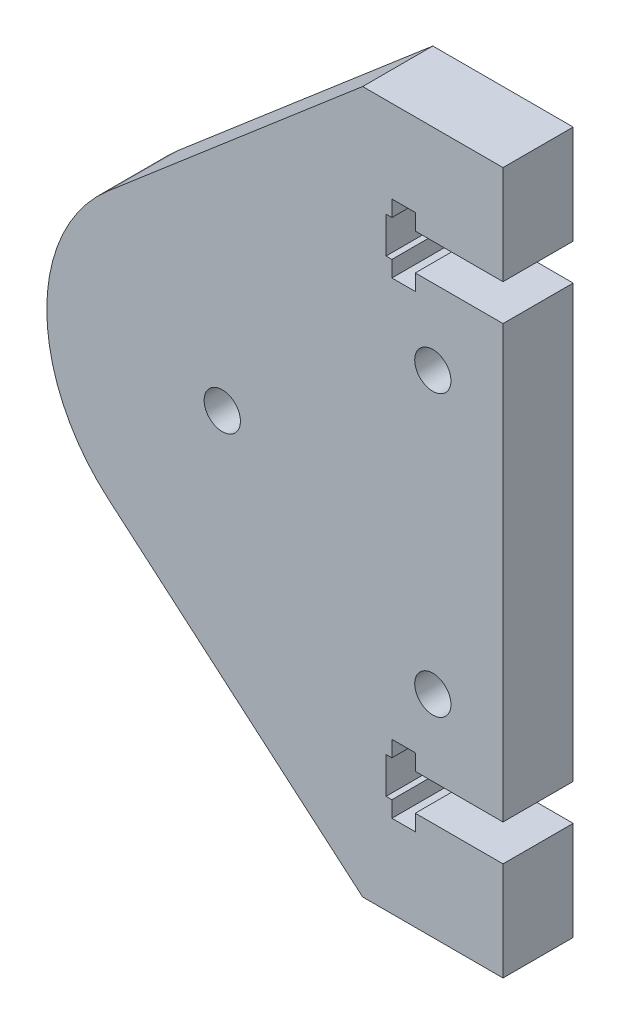
ISO-10303-21;
HEADER;
FILE_DESCRIPTION(('STEP AP214'),'2;1');
FILE_NAME('part.step','',(''),(''),'','','');
FILE_SCHEMA(('AUTOMOTIVE_DESIGN { 1 0 10303 214 1 1 1 1 }'));
ENDSEC;
DATA;
#1=APPLICATION_CONTEXT('core data for automotive mechanical design processes');
#2=APPLICATION_PROTOCOL_DEFINITION('international standard','automotive_design',2000,#1);
#3=PRODUCT_CONTEXT('',#1,'mechanical');
#4=PRODUCT('Part','Part','',(#3));
#5=PRODUCT_RELATED_PRODUCT_CATEGORY('part','',(#4));
#6=PRODUCT_DEFINITION_FORMATION('','',#4);
#7=PRODUCT_DEFINITION_CONTEXT('part definition',#1,'design');
#8=PRODUCT_DEFINITION('design','',#6,#7);
#9=PRODUCT_DEFINITION_SHAPE('','',#8);
#10=(LENGTH_UNIT() NAMED_UNIT(*) SI_UNIT(.MILLI.,.METRE.));
#11=(NAMED_UNIT(*) PLANE_ANGLE_UNIT() SI_UNIT($,.RADIAN.));
#12=(NAMED_UNIT(*) SI_UNIT($,.STERADIAN.) SOLID_ANGLE_UNIT());
#13=UNCERTAINTY_MEASURE_WITH_UNIT(LENGTH_MEASURE(1.E-05),#10,'distance_accuracy_value','');
#14=(GEOMETRIC_REPRESENTATION_CONTEXT(3) GLOBAL_UNCERTAINTY_ASSIGNED_CONTEXT((#13)) GLOBAL_UNIT_ASSIGNED_CONTEXT((#10,
#11,#12)) REPRESENTATION_CONTEXT('',''));
#15=CARTESIAN_POINT('',(0.,0.,0.));
#16=DIRECTION('',(0.,0.,1.));
#17=DIRECTION('',(1.,0.,0.));
#18=AXIS2_PLACEMENT_3D('',#15,#16,#17);
#19=CARTESIAN_POINT('',(-443.064585695293,-53.9557688613445,6.));
#20=DIRECTION('',(-1.,0.,0.));
#21=DIRECTION('',(0.,0.,1.));
#22=AXIS2_PLACEMENT_3D('',#19,#20,#21);
#23=PLANE('',#22);
#24=DIRECTION('',(0.,1.,0.));
#25=VECTOR('',#24,1.);
#26=CARTESIAN_POINT('',(-443.064585695293,-53.9557688613445,6.));
#27=LINE('',#26,#25);
#28=CARTESIAN_POINT('',(-443.064585695293,-62.4057688613445,6.));
#29=VERTEX_POINT('',#28);
#30=CARTESIAN_POINT('',(-443.064585695293,-53.9557688613445,6.));
#31=VERTEX_POINT('',#30);
#32=EDGE_CURVE('E259',#29,#31,#27,.T.);
#33=ORIENTED_EDGE('',*,*,#32,.F.);
#34=DIRECTION('',(0.,0.,-1.));
#35=VECTOR('',#34,1.);
#36=CARTESIAN_POINT('',(-443.064585695293,-62.4057688613445,6.));
#37=LINE('',#36,#35);
#38=CARTESIAN_POINT('',(-443.064585695293,-62.4057688613445,0.));
#39=VERTEX_POINT('',#38);
#40=EDGE_CURVE('E331',#29,#39,#37,.T.);
#41=ORIENTED_EDGE('',*,*,#40,.T.);
#42=DIRECTION('',(0.,1.,0.));
#43=VECTOR('',#42,1.);
#44=CARTESIAN_POINT('',(-443.064585695293,-53.9557688613445,0.));
#45=LINE('',#44,#43);
#46=CARTESIAN_POINT('',(-443.064585695293,-53.9557688613445,0.));
#47=VERTEX_POINT('',#46);
#48=EDGE_CURVE('E278',#39,#47,#45,.T.);
#49=ORIENTED_EDGE('',*,*,#48,.T.);
#50=DIRECTION('',(0.,0.,-1.));
#51=VECTOR('',#50,1.);
#52=CARTESIAN_POINT('',(-443.064585695293,-53.9557688613445,6.));
#53=LINE('',#52,#51);
#54=EDGE_CURVE('E42',#31,#47,#53,.T.);
#55=ORIENTED_EDGE('',*,*,#54,.F.);
#56=EDGE_LOOP('',(#33,#41,#49,#55));
#57=FACE_BOUND('',#56,.T.);
#58=ADVANCED_FACE('F34',(#57),#23,.F.);
#59=CARTESIAN_POINT('',(-443.064585695293,-102.405768861344,0.));
#60=VERTEX_POINT('',#59);
#61=CARTESIAN_POINT('',(-443.064585695293,-65.5057688613445,0.));
#62=VERTEX_POINT('',#61);
#63=EDGE_CURVE('E248',#60,#62,#45,.T.);
#64=ORIENTED_EDGE('',*,*,#63,.T.);
#65=DIRECTION('',(0.,0.,-1.));
#66=VECTOR('',#65,1.);
#67=CARTESIAN_POINT('',(-443.064585695293,-65.5057688613445,6.));
#68=LINE('',#67,#66);
#69=CARTESIAN_POINT('',(-443.064585695293,-65.5057688613445,6.));
#70=VERTEX_POINT('',#69);
#71=EDGE_CURVE('E49',#70,#62,#68,.T.);
#72=ORIENTED_EDGE('',*,*,#71,.F.);
#73=CARTESIAN_POINT('',(-443.064585695293,-102.405768861344,6.));
#74=VERTEX_POINT('',#73);
#75=EDGE_CURVE('E246',#74,#70,#27,.T.);
#76=ORIENTED_EDGE('',*,*,#75,.F.);
#77=DIRECTION('',(0.,0.,-1.));
#78=VECTOR('',#77,1.);
#79=CARTESIAN_POINT('',(-443.064585695293,-102.405768861344,6.));
#80=LINE('',#79,#78);
#81=EDGE_CURVE('E417',#74,#60,#80,.T.);
#82=ORIENTED_EDGE('',*,*,#81,.T.);
#83=EDGE_LOOP('',(#64,#72,#76,#82));
#84=FACE_BOUND('',#83,.T.);
#85=ADVANCED_FACE('F244',(#84),#23,.F.);
#86=CARTESIAN_POINT('',(-455.064585695293,-113.955768861344,6.));
#87=DIRECTION('',(0.,1.,0.));
#88=DIRECTION('',(0.,0.,1.));
#89=AXIS2_PLACEMENT_3D('',#86,#87,#88);
#90=PLANE('',#89);
#91=DIRECTION('',(1.,0.,0.));
#92=VECTOR('',#91,1.);
#93=CARTESIAN_POINT('',(-455.064585695293,-113.955768861344,0.));
#94=LINE('',#93,#92);
#95=CARTESIAN_POINT('',(-455.064585695293,-113.955768861344,0.));
#96=VERTEX_POINT('',#95);
#97=CARTESIAN_POINT('',(-443.064585695293,-113.955768861344,0.));
#98=VERTEX_POINT('',#97);
#99=EDGE_CURVE('E275',#96,#98,#94,.T.);
#100=ORIENTED_EDGE('',*,*,#99,.T.);
#101=DIRECTION('',(0.,0.,-1.));
#102=VECTOR('',#101,1.);
#103=CARTESIAN_POINT('',(-443.064585695293,-113.955768861344,6.));
#104=LINE('',#103,#102);
#105=CARTESIAN_POINT('',(-443.064585695293,-113.955768861344,6.));
#106=VERTEX_POINT('',#105);
#107=EDGE_CURVE('E11',#106,#98,#104,.T.);
#108=ORIENTED_EDGE('',*,*,#107,.F.);
#109=DIRECTION('',(1.,0.,0.));
#110=VECTOR('',#109,1.);
#111=CARTESIAN_POINT('',(-455.064585695293,-113.955768861344,6.));
#112=LINE('',#111,#110);
#113=CARTESIAN_POINT('',(-455.064585695293,-113.955768861344,6.));
#114=VERTEX_POINT('',#113);
#115=EDGE_CURVE('E263',#114,#106,#112,.T.);
#116=ORIENTED_EDGE('',*,*,#115,.F.);
#117=DIRECTION('',(0.,0.,-1.));
#118=VECTOR('',#117,1.);
#119=CARTESIAN_POINT('',(-455.064585695293,-113.955768861344,6.));
#120=LINE('',#119,#118);
#121=EDGE_CURVE('E274',#114,#96,#120,.T.);
#122=ORIENTED_EDGE('',*,*,#121,.T.);
#123=EDGE_LOOP('',(#100,#108,#116,#122));
#124=FACE_BOUND('',#123,.T.);
#125=ADVANCED_FACE('F36',(#124),#90,.F.);
#126=CARTESIAN_POINT('',(-443.064585695293,-105.505768861344,0.));
#127=VERTEX_POINT('',#126);
#128=EDGE_CURVE('E280',#98,#127,#45,.T.);
#129=ORIENTED_EDGE('',*,*,#128,.T.);
#130=DIRECTION('',(0.,0.,-1.));
#131=VECTOR('',#130,1.);
#132=CARTESIAN_POINT('',(-443.064585695293,-105.505768861344,6.));
#133=LINE('',#132,#131);
#134=CARTESIAN_POINT('',(-443.064585695293,-105.505768861344,6.));
#135=VERTEX_POINT('',#134);
#136=EDGE_CURVE('E57',#135,#127,#133,.T.);
#137=ORIENTED_EDGE('',*,*,#136,.F.);
#138=EDGE_CURVE('E258',#106,#135,#27,.T.);
#139=ORIENTED_EDGE('',*,*,#138,.F.);
#140=ORIENTED_EDGE('',*,*,#107,.T.);
#141=EDGE_LOOP('',(#129,#137,#139,#140));
#142=FACE_BOUND('',#141,.T.);
#143=ADVANCED_FACE('F462',(#142),#23,.F.);
#144=CARTESIAN_POINT('',(-443.064585695293,-53.9557688613445,6.));
#145=DIRECTION('',(0.,-1.,0.));
#146=DIRECTION('',(0.,0.,-1.));
#147=AXIS2_PLACEMENT_3D('',#144,#145,#146);
#148=PLANE('',#147);
#149=DIRECTION('',(-1.,0.,0.));
#150=VECTOR('',#149,1.);
#151=CARTESIAN_POINT('',(-443.064585695293,-53.9557688613445,0.));
#152=LINE('',#151,#150);
#153=CARTESIAN_POINT('',(-455.064585695293,-53.9557688613445,0.));
#154=VERTEX_POINT('',#153);
#155=EDGE_CURVE('E283',#47,#154,#152,.T.);
#156=ORIENTED_EDGE('',*,*,#155,.T.);
#157=DIRECTION('',(0.,0.,-1.));
#158=VECTOR('',#157,1.);
#159=CARTESIAN_POINT('',(-455.064585695293,-53.9557688613445,6.));
#160=LINE('',#159,#158);
#161=CARTESIAN_POINT('',(-455.064585695293,-53.9557688613445,6.));
#162=VERTEX_POINT('',#161);
#163=EDGE_CURVE('E299',#162,#154,#160,.T.);
#164=ORIENTED_EDGE('',*,*,#163,.F.);
#165=DIRECTION('',(-1.,0.,0.));
#166=VECTOR('',#165,1.);
#167=CARTESIAN_POINT('',(-443.064585695293,-53.9557688613445,6.));
#168=LINE('',#167,#166);
#169=EDGE_CURVE('E262',#31,#162,#168,.T.);
#170=ORIENTED_EDGE('',*,*,#169,.F.);
#171=ORIENTED_EDGE('',*,*,#54,.T.);
#172=EDGE_LOOP('',(#156,#164,#170,#171));
#173=FACE_BOUND('',#172,.T.);
#174=ADVANCED_FACE('F306',(#173),#148,.F.);
#175=CARTESIAN_POINT('',(-455.064585695293,-53.9557688613445,6.));
#176=DIRECTION('',(0.649947587428402,-0.759979034971359,0.));
#177=DIRECTION('',(0.75997903497136,0.649947587428403,0.));
#178=AXIS2_PLACEMENT_3D('',#175,#176,#177);
#179=PLANE('',#178);
#180=DIRECTION('',(-0.75997903497136,-0.649947587428403,0.));
#181=VECTOR('',#180,1.);
#182=CARTESIAN_POINT('',(-455.064585695293,-53.9557688613445,0.));
#183=LINE('',#182,#181);
#184=CARTESIAN_POINT('',(-476.813799506719,-72.5560833367741,0.));
#185=VERTEX_POINT('',#184);
#186=EDGE_CURVE('E285',#154,#185,#183,.T.);
#187=ORIENTED_EDGE('',*,*,#186,.T.);
#188=DIRECTION('',(0.,0.,-1.));
#189=VECTOR('',#188,1.);
#190=CARTESIAN_POINT('',(-476.813799506719,-72.5560833367741,6.));
#191=LINE('',#190,#189);
#192=CARTESIAN_POINT('',(-476.813799506719,-72.5560833367741,6.));
#193=VERTEX_POINT('',#192);
#194=EDGE_CURVE('E296',#193,#185,#191,.T.);
#195=ORIENTED_EDGE('',*,*,#194,.F.);
#196=DIRECTION('',(-0.75997903497136,-0.649947587428403,0.));
#197=VECTOR('',#196,1.);
#198=CARTESIAN_POINT('',(-455.064585695293,-53.9557688613445,6.));
#199=LINE('',#198,#197);
#200=EDGE_CURVE('E268',#162,#193,#199,.T.);
#201=ORIENTED_EDGE('',*,*,#200,.F.);
#202=ORIENTED_EDGE('',*,*,#163,.T.);
#203=EDGE_LOOP('',(#187,#195,#201,#202));
#204=FACE_BOUND('',#203,.T.);
#205=ADVANCED_FACE('F319',(#204),#179,.F.);
#206=CARTESIAN_POINT('',(-467.064585695293,-83.9557688613445,6.));
#207=DIRECTION('',(0.,0.,-1.));
#208=DIRECTION('',(-1.,0.,0.));
#209=AXIS2_PLACEMENT_3D('',#206,#207,#208);
#210=CYLINDRICAL_SURFACE('',#209,15.);
#211=CARTESIAN_POINT('',(-467.064585695293,-83.9557688613445,0.));
#212=DIRECTION('',(0.,0.,1.));
#213=DIRECTION('',(1.,0.,0.));
#214=AXIS2_PLACEMENT_3D('',#211,#212,#213);
#215=CIRCLE('',#214,15.);
#216=CARTESIAN_POINT('',(-476.813799506719,-95.3554543859149,0.));
#217=VERTEX_POINT('',#216);
#218=EDGE_CURVE('E287',#185,#217,#215,.T.);
#219=ORIENTED_EDGE('',*,*,#218,.T.);
#220=DIRECTION('',(0.,0.,-1.));
#221=VECTOR('',#220,1.);
#222=CARTESIAN_POINT('',(-476.813799506719,-95.3554543859149,6.));
#223=LINE('',#222,#221);
#224=CARTESIAN_POINT('',(-476.813799506719,-95.3554543859149,6.));
#225=VERTEX_POINT('',#224);
#226=EDGE_CURVE('E293',#225,#217,#223,.T.);
#227=ORIENTED_EDGE('',*,*,#226,.F.);
#228=CARTESIAN_POINT('',(-467.064585695293,-83.9557688613445,6.));
#229=DIRECTION('',(0.,0.,1.));
#230=DIRECTION('',(1.,0.,0.));
#231=AXIS2_PLACEMENT_3D('',#228,#229,#230);
#232=CIRCLE('',#231,15.);
#233=EDGE_CURVE('E270',#193,#225,#232,.T.);
#234=ORIENTED_EDGE('',*,*,#233,.F.);
#235=ORIENTED_EDGE('',*,*,#194,.T.);
#236=EDGE_LOOP('',(#219,#227,#234,#235));
#237=FACE_BOUND('',#236,.T.);
#238=ADVANCED_FACE('F323',(#237),#210,.T.);
#239=CARTESIAN_POINT('',(-455.064585695293,-113.955768861344,6.));
#240=DIRECTION('',(0.649947587428402,0.75997903497136,0.));
#241=DIRECTION('',(-0.75997903497136,0.649947587428402,0.));
#242=AXIS2_PLACEMENT_3D('',#239,#240,#241);
#243=PLANE('',#242);
#244=DIRECTION('',(0.75997903497136,-0.649947587428402,0.));
#245=VECTOR('',#244,1.);
#246=CARTESIAN_POINT('',(-455.064585695293,-113.955768861344,0.));
#247=LINE('',#246,#245);
#248=EDGE_CURVE('E289',#217,#96,#247,.T.);
#249=ORIENTED_EDGE('',*,*,#248,.T.);
#250=ORIENTED_EDGE('',*,*,#121,.F.);
#251=DIRECTION('',(0.75997903497136,-0.649947587428402,0.));
#252=VECTOR('',#251,1.);
#253=CARTESIAN_POINT('',(-455.064585695293,-113.955768861344,6.));
#254=LINE('',#253,#252);
#255=EDGE_CURVE('E272',#225,#114,#254,.T.);
#256=ORIENTED_EDGE('',*,*,#255,.F.);
#257=ORIENTED_EDGE('',*,*,#226,.T.);
#258=EDGE_LOOP('',(#249,#250,#256,#257));
#259=FACE_BOUND('',#258,.T.);
#260=ADVANCED_FACE('F447',(#259),#243,.F.);
#261=CARTESIAN_POINT('',(-467.064585695293,-83.9557688613445,6.));
#262=DIRECTION('',(0.,0.,1.));
#263=DIRECTION('',(1.,0.,0.));
#264=AXIS2_PLACEMENT_3D('',#261,#262,#263);
#265=PLANE('',#264);
#266=CARTESIAN_POINT('',(-449.064585016784,-71.9707693447421,6.));
#267=DIRECTION('',(0.,0.,-1.));
#268=DIRECTION('',(-1.,0.,0.));
#269=AXIS2_PLACEMENT_3D('',#266,#267,#268);
#270=CIRCLE('',#269,1.55000000000005);
#271=CARTESIAN_POINT('',(-450.614585016784,-71.9707693447421,6.));
#272=VERTEX_POINT('',#271);
#273=EDGE_CURVE('E811',#272,#272,#270,.T.);
#274=ORIENTED_EDGE('',*,*,#273,.T.);
#275=EDGE_LOOP('',(#274));
#276=FACE_BOUND('',#275,.T.);
#277=CARTESIAN_POINT('',(-449.064585016784,-95.9367759641504,6.));
#278=DIRECTION('',(0.,0.,-1.));
#279=DIRECTION('',(-1.,0.,0.));
#280=AXIS2_PLACEMENT_3D('',#277,#278,#279);
#281=CIRCLE('',#280,1.55000000000005);
#282=CARTESIAN_POINT('',(-450.614585016784,-95.9367759641504,6.));
#283=VERTEX_POINT('',#282);
#284=EDGE_CURVE('E522',#283,#283,#281,.T.);
#285=ORIENTED_EDGE('',*,*,#284,.T.);
#286=EDGE_LOOP('',(#285));
#287=FACE_BOUND('',#286,.T.);
#288=DIRECTION('',(1.,0.,0.));
#289=VECTOR('',#288,1.);
#290=CARTESIAN_POINT('',(-443.064585695293,-62.4057688613445,6.));
#291=LINE('',#290,#289);
#292=CARTESIAN_POINT('',(-450.564585695293,-62.4057688613445,6.));
#293=VERTEX_POINT('',#292);
#294=EDGE_CURVE('E249',#293,#29,#291,.T.);
#295=ORIENTED_EDGE('',*,*,#294,.T.);
#296=ORIENTED_EDGE('',*,*,#32,.T.);
#297=ORIENTED_EDGE('',*,*,#169,.T.);
#298=ORIENTED_EDGE('',*,*,#200,.T.);
#299=ORIENTED_EDGE('',*,*,#233,.T.);
#300=ORIENTED_EDGE('',*,*,#255,.T.);
#301=ORIENTED_EDGE('',*,*,#115,.T.);
#302=ORIENTED_EDGE('',*,*,#138,.T.);
#303=DIRECTION('',(-1.,0.,0.));
#304=VECTOR('',#303,1.);
#305=CARTESIAN_POINT('',(-443.064585695293,-105.505768861344,6.));
#306=LINE('',#305,#304);
#307=CARTESIAN_POINT('',(-450.564585695293,-105.505768861344,6.));
#308=VERTEX_POINT('',#307);
#309=EDGE_CURVE('E359',#135,#308,#306,.T.);
#310=ORIENTED_EDGE('',*,*,#309,.T.);
#311=DIRECTION('',(0.,-1.,0.));
#312=VECTOR('',#311,1.);
#313=CARTESIAN_POINT('',(-450.564585695293,-106.880768861344,6.));
#314=LINE('',#313,#312);
#315=CARTESIAN_POINT('',(-450.564585695293,-106.880768861344,6.));
#316=VERTEX_POINT('',#315);
#317=EDGE_CURVE('E362',#308,#316,#314,.T.);
#318=ORIENTED_EDGE('',*,*,#317,.T.);
#319=DIRECTION('',(-1.,0.,0.));
#320=VECTOR('',#319,1.);
#321=CARTESIAN_POINT('',(-452.564585695293,-106.880768861344,6.));
#322=LINE('',#321,#320);
#323=CARTESIAN_POINT('',(-452.564585695293,-106.880768861344,6.));
#324=VERTEX_POINT('',#323);
#325=EDGE_CURVE('E366',#316,#324,#322,.T.);
#326=ORIENTED_EDGE('',*,*,#325,.T.);
#327=DIRECTION('',(0.,1.,0.));
#328=VECTOR('',#327,1.);
#329=CARTESIAN_POINT('',(-452.564585695293,-106.880768861344,6.));
#330=LINE('',#329,#328);
#331=CARTESIAN_POINT('',(-452.564585695293,-105.505768861344,6.));
#332=VERTEX_POINT('',#331);
#333=EDGE_CURVE('E369',#324,#332,#330,.T.);
#334=ORIENTED_EDGE('',*,*,#333,.T.);
#335=DIRECTION('',(-1.,0.,0.));
#336=VECTOR('',#335,1.);
#337=CARTESIAN_POINT('',(-452.564585695293,-105.505768861344,6.));
#338=LINE('',#337,#336);
#339=CARTESIAN_POINT('',(-453.064585695293,-105.505768861344,6.));
#340=VERTEX_POINT('',#339);
#341=EDGE_CURVE('E372',#332,#340,#338,.T.);
#342=ORIENTED_EDGE('',*,*,#341,.T.);
#343=DIRECTION('',(0.,1.,0.));
#344=VECTOR('',#343,1.);
#345=CARTESIAN_POINT('',(-453.064585695293,-105.505768861344,6.));
#346=LINE('',#345,#344);
#347=CARTESIAN_POINT('',(-453.064585695293,-102.405768861344,6.));
#348=VERTEX_POINT('',#347);
#349=EDGE_CURVE('E375',#340,#348,#346,.T.);
#350=ORIENTED_EDGE('',*,*,#349,.T.);
#351=DIRECTION('',(1.,0.,0.));
#352=VECTOR('',#351,1.);
#353=CARTESIAN_POINT('',(-452.564585695293,-102.405768861344,6.));
#354=LINE('',#353,#352);
#355=CARTESIAN_POINT('',(-452.564585695293,-102.405768861344,6.));
#356=VERTEX_POINT('',#355);
#357=EDGE_CURVE('E378',#348,#356,#354,.T.);
#358=ORIENTED_EDGE('',*,*,#357,.T.);
#359=DIRECTION('',(0.,1.,0.));
#360=VECTOR('',#359,1.);
#361=CARTESIAN_POINT('',(-452.564585695293,-102.405768861344,6.));
#362=LINE('',#361,#360);
#363=CARTESIAN_POINT('',(-452.564585695293,-101.030768861344,6.));
#364=VERTEX_POINT('',#363);
#365=EDGE_CURVE('E381',#356,#364,#362,.T.);
#366=ORIENTED_EDGE('',*,*,#365,.T.);
#367=DIRECTION('',(1.,0.,0.));
#368=VECTOR('',#367,1.);
#369=CARTESIAN_POINT('',(-452.564585695293,-101.030768861344,6.));
#370=LINE('',#369,#368);
#371=CARTESIAN_POINT('',(-450.564585695293,-101.030768861344,6.));
#372=VERTEX_POINT('',#371);
#373=EDGE_CURVE('E384',#364,#372,#370,.T.);
#374=ORIENTED_EDGE('',*,*,#373,.T.);
#375=DIRECTION('',(0.,-1.,0.));
#376=VECTOR('',#375,1.);
#377=CARTESIAN_POINT('',(-450.564585695293,-102.405768861344,6.));
#378=LINE('',#377,#376);
#379=CARTESIAN_POINT('',(-450.564585695293,-102.405768861344,6.));
#380=VERTEX_POINT('',#379);
#381=EDGE_CURVE('E387',#372,#380,#378,.T.);
#382=ORIENTED_EDGE('',*,*,#381,.T.);
#383=DIRECTION('',(1.,0.,0.));
#384=VECTOR('',#383,1.);
#385=CARTESIAN_POINT('',(-443.064585695293,-102.405768861344,6.));
#386=LINE('',#385,#384);
#387=EDGE_CURVE('E257',#380,#74,#386,.T.);
#388=ORIENTED_EDGE('',*,*,#387,.T.);
#389=ORIENTED_EDGE('',*,*,#75,.T.);
#390=DIRECTION('',(-1.,0.,0.));
#391=VECTOR('',#390,1.);
#392=CARTESIAN_POINT('',(-443.064585695293,-65.5057688613445,6.));
#393=LINE('',#392,#391);
#394=CARTESIAN_POINT('',(-450.564585695293,-65.5057688613445,6.));
#395=VERTEX_POINT('',#394);
#396=EDGE_CURVE('E231',#70,#395,#393,.T.);
#397=ORIENTED_EDGE('',*,*,#396,.T.);
#398=DIRECTION('',(0.,-1.,0.));
#399=VECTOR('',#398,1.);
#400=CARTESIAN_POINT('',(-450.564585695293,-66.8807688613445,6.));
#401=LINE('',#400,#399);
#402=CARTESIAN_POINT('',(-450.564585695293,-66.8807688613445,6.));
#403=VERTEX_POINT('',#402);
#404=EDGE_CURVE('E238',#395,#403,#401,.T.);
#405=ORIENTED_EDGE('',*,*,#404,.T.);
#406=DIRECTION('',(-1.,0.,0.));
#407=VECTOR('',#406,1.);
#408=CARTESIAN_POINT('',(-452.564585695293,-66.8807688613445,6.));
#409=LINE('',#408,#407);
#410=CARTESIAN_POINT('',(-452.564585695293,-66.8807688613445,6.));
#411=VERTEX_POINT('',#410);
#412=EDGE_CURVE('E595',#403,#411,#409,.T.);
#413=ORIENTED_EDGE('',*,*,#412,.T.);
#414=DIRECTION('',(0.,1.,0.));
#415=VECTOR('',#414,1.);
#416=CARTESIAN_POINT('',(-452.564585695293,-66.8807688613445,6.));
#417=LINE('',#416,#415);
#418=CARTESIAN_POINT('',(-452.564585695293,-65.5057688613445,6.));
#419=VERTEX_POINT('',#418);
#420=EDGE_CURVE('E599',#411,#419,#417,.T.);
#421=ORIENTED_EDGE('',*,*,#420,.T.);
#422=DIRECTION('',(-1.,0.,0.));
#423=VECTOR('',#422,1.);
#424=CARTESIAN_POINT('',(-452.564585695293,-65.5057688613445,6.));
#425=LINE('',#424,#423);
#426=CARTESIAN_POINT('',(-453.064585695293,-65.5057688613445,6.));
#427=VERTEX_POINT('',#426);
#428=EDGE_CURVE('E586',#419,#427,#425,.T.);
#429=ORIENTED_EDGE('',*,*,#428,.T.);
#430=DIRECTION('',(0.,1.,0.));
#431=VECTOR('',#430,1.);
#432=CARTESIAN_POINT('',(-453.064585695293,-65.5057688613445,6.));
#433=LINE('',#432,#431);
#434=CARTESIAN_POINT('',(-453.064585695293,-62.4057688613445,6.));
#435=VERTEX_POINT('',#434);
#436=EDGE_CURVE('E581',#427,#435,#433,.T.);
#437=ORIENTED_EDGE('',*,*,#436,.T.);
#438=DIRECTION('',(1.,0.,0.));
#439=VECTOR('',#438,1.);
#440=CARTESIAN_POINT('',(-452.564585695293,-62.4057688613445,6.));
#441=LINE('',#440,#439);
#442=CARTESIAN_POINT('',(-452.564585695293,-62.4057688613445,6.));
#443=VERTEX_POINT('',#442);
#444=EDGE_CURVE('E606',#435,#443,#441,.T.);
#445=ORIENTED_EDGE('',*,*,#444,.T.);
#446=DIRECTION('',(0.,1.,0.));
#447=VECTOR('',#446,1.);
#448=CARTESIAN_POINT('',(-452.564585695293,-62.4057688613445,6.));
#449=LINE('',#448,#447);
#450=CARTESIAN_POINT('',(-452.564585695293,-61.0307688613445,6.));
#451=VERTEX_POINT('',#450);
#452=EDGE_CURVE('E569',#443,#451,#449,.T.);
#453=ORIENTED_EDGE('',*,*,#452,.T.);
#454=DIRECTION('',(1.,0.,0.));
#455=VECTOR('',#454,1.);
#456=CARTESIAN_POINT('',(-452.564585695293,-61.0307688613445,6.));
#457=LINE('',#456,#455);
#458=CARTESIAN_POINT('',(-450.564585695293,-61.0307688613445,6.));
#459=VERTEX_POINT('',#458);
#460=EDGE_CURVE('E564',#451,#459,#457,.T.);
#461=ORIENTED_EDGE('',*,*,#460,.T.);
#462=DIRECTION('',(0.,-1.,0.));
#463=VECTOR('',#462,1.);
#464=CARTESIAN_POINT('',(-450.564585695293,-62.4057688613445,6.));
#465=LINE('',#464,#463);
#466=EDGE_CURVE('E609',#459,#293,#465,.T.);
#467=ORIENTED_EDGE('',*,*,#466,.T.);
#468=EDGE_LOOP('',(#295,#296,#297,#298,#299,#300,#301,#302,#310,#318,#326,#334,#342,#350,#358,
#366,#374,#382,#388,#389,#397,#405,#413,#421,#429,#437,#445,#453,#461,#467));
#469=FACE_BOUND('',#468,.T.);
#470=CARTESIAN_POINT('',(-467.064585695293,-83.9557688613445,6.));
#471=DIRECTION('',(0.,0.,1.));
#472=DIRECTION('',(1.,0.,0.));
#473=AXIS2_PLACEMENT_3D('',#470,#471,#472);
#474=CIRCLE('',#473,1.54999999999999);
#475=CARTESIAN_POINT('',(-465.514585695293,-83.9557688613445,6.));
#476=VERTEX_POINT('',#475);
#477=EDGE_CURVE('E419',#476,#476,#474,.T.);
#478=ORIENTED_EDGE('',*,*,#477,.F.);
#479=EDGE_LOOP('',(#478));
#480=FACE_BOUND('',#479,.T.);
#481=ADVANCED_FACE('F253',(#276,#287,#469,#480),#265,.T.);
#482=CARTESIAN_POINT('',(-467.064585695293,-83.9557688613445,0.));
#483=DIRECTION('',(0.,0.,1.));
#484=DIRECTION('',(1.,0.,0.));
#485=AXIS2_PLACEMENT_3D('',#482,#483,#484);
#486=PLANE('',#485);
#487=CARTESIAN_POINT('',(-449.064585016784,-71.9707693447421,0.));
#488=DIRECTION('',(0.,0.,-1.));
#489=DIRECTION('',(-1.,0.,0.));
#490=AXIS2_PLACEMENT_3D('',#487,#488,#489);
#491=CIRCLE('',#490,1.55000000000005);
#492=CARTESIAN_POINT('',(-450.614585016784,-71.9707693447421,0.));
#493=VERTEX_POINT('',#492);
#494=EDGE_CURVE('E814',#493,#493,#491,.T.);
#495=ORIENTED_EDGE('',*,*,#494,.F.);
#496=EDGE_LOOP('',(#495));
#497=FACE_BOUND('',#496,.T.);
#498=CARTESIAN_POINT('',(-449.064585016784,-95.9367759641504,0.));
#499=DIRECTION('',(0.,0.,-1.));
#500=DIRECTION('',(-1.,0.,0.));
#501=AXIS2_PLACEMENT_3D('',#498,#499,#500);
#502=CIRCLE('',#501,1.55000000000005);
#503=CARTESIAN_POINT('',(-450.614585016784,-95.9367759641504,0.));
#504=VERTEX_POINT('',#503);
#505=EDGE_CURVE('E527',#504,#504,#502,.T.);
#506=ORIENTED_EDGE('',*,*,#505,.F.);
#507=EDGE_LOOP('',(#506));
#508=FACE_BOUND('',#507,.T.);
#509=CARTESIAN_POINT('',(-467.064585695293,-83.9557688613445,0.));
#510=DIRECTION('',(0.,0.,1.));
#511=DIRECTION('',(1.,0.,0.));
#512=AXIS2_PLACEMENT_3D('',#509,#510,#511);
#513=CIRCLE('',#512,1.54999999999999);
#514=CARTESIAN_POINT('',(-465.514585695293,-83.9557688613445,0.));
#515=VERTEX_POINT('',#514);
#516=EDGE_CURVE('E279',#515,#515,#513,.T.);
#517=ORIENTED_EDGE('',*,*,#516,.T.);
#518=EDGE_LOOP('',(#517));
#519=FACE_BOUND('',#518,.T.);
#520=ORIENTED_EDGE('',*,*,#48,.F.);
#521=DIRECTION('',(1.,0.,0.));
#522=VECTOR('',#521,1.);
#523=CARTESIAN_POINT('',(-443.064585695293,-62.4057688613445,0.));
#524=LINE('',#523,#522);
#525=CARTESIAN_POINT('',(-450.564585695293,-62.4057688613445,0.));
#526=VERTEX_POINT('',#525);
#527=EDGE_CURVE('E239',#526,#39,#524,.T.);
#528=ORIENTED_EDGE('',*,*,#527,.F.);
#529=DIRECTION('',(0.,-1.,0.));
#530=VECTOR('',#529,1.);
#531=CARTESIAN_POINT('',(-450.564585695293,-62.4057688613445,0.));
#532=LINE('',#531,#530);
#533=CARTESIAN_POINT('',(-450.564585695293,-61.0307688613445,0.));
#534=VERTEX_POINT('',#533);
#535=EDGE_CURVE('E551',#534,#526,#532,.T.);
#536=ORIENTED_EDGE('',*,*,#535,.F.);
#537=DIRECTION('',(1.,0.,0.));
#538=VECTOR('',#537,1.);
#539=CARTESIAN_POINT('',(-452.564585695293,-61.0307688613445,0.));
#540=LINE('',#539,#538);
#541=CARTESIAN_POINT('',(-452.564585695293,-61.0307688613445,0.));
#542=VERTEX_POINT('',#541);
#543=EDGE_CURVE('E549',#542,#534,#540,.T.);
#544=ORIENTED_EDGE('',*,*,#543,.F.);
#545=DIRECTION('',(0.,1.,0.));
#546=VECTOR('',#545,1.);
#547=CARTESIAN_POINT('',(-452.564585695293,-62.4057688613445,0.));
#548=LINE('',#547,#546);
#549=CARTESIAN_POINT('',(-452.564585695293,-62.4057688613445,0.));
#550=VERTEX_POINT('',#549);
#551=EDGE_CURVE('E546',#550,#542,#548,.T.);
#552=ORIENTED_EDGE('',*,*,#551,.F.);
#553=DIRECTION('',(1.,0.,0.));
#554=VECTOR('',#553,1.);
#555=CARTESIAN_POINT('',(-452.564585695293,-62.4057688613445,0.));
#556=LINE('',#555,#554);
#557=CARTESIAN_POINT('',(-453.064585695293,-62.4057688613445,0.));
#558=VERTEX_POINT('',#557);
#559=EDGE_CURVE('E543',#558,#550,#556,.T.);
#560=ORIENTED_EDGE('',*,*,#559,.F.);
#561=DIRECTION('',(0.,1.,0.));
#562=VECTOR('',#561,1.);
#563=CARTESIAN_POINT('',(-453.064585695293,-65.5057688613445,0.));
#564=LINE('',#563,#562);
#565=CARTESIAN_POINT('',(-453.064585695293,-65.5057688613445,0.));
#566=VERTEX_POINT('',#565);
#567=EDGE_CURVE('E540',#566,#558,#564,.T.);
#568=ORIENTED_EDGE('',*,*,#567,.F.);
#569=DIRECTION('',(-1.,0.,0.));
#570=VECTOR('',#569,1.);
#571=CARTESIAN_POINT('',(-452.564585695293,-65.5057688613445,0.));
#572=LINE('',#571,#570);
#573=CARTESIAN_POINT('',(-452.564585695293,-65.5057688613445,0.));
#574=VERTEX_POINT('',#573);
#575=EDGE_CURVE('E537',#574,#566,#572,.T.);
#576=ORIENTED_EDGE('',*,*,#575,.F.);
#577=DIRECTION('',(0.,1.,0.));
#578=VECTOR('',#577,1.);
#579=CARTESIAN_POINT('',(-452.564585695293,-66.8807688613445,0.));
#580=LINE('',#579,#578);
#581=CARTESIAN_POINT('',(-452.564585695293,-66.8807688613445,0.));
#582=VERTEX_POINT('',#581);
#583=EDGE_CURVE('E534',#582,#574,#580,.T.);
#584=ORIENTED_EDGE('',*,*,#583,.F.);
#585=DIRECTION('',(-1.,0.,0.));
#586=VECTOR('',#585,1.);
#587=CARTESIAN_POINT('',(-452.564585695293,-66.8807688613445,0.));
#588=LINE('',#587,#586);
#589=CARTESIAN_POINT('',(-450.564585695293,-66.8807688613445,0.));
#590=VERTEX_POINT('',#589);
#591=EDGE_CURVE('E524',#590,#582,#588,.T.);
#592=ORIENTED_EDGE('',*,*,#591,.F.);
#593=DIRECTION('',(0.,-1.,0.));
#594=VECTOR('',#593,1.);
#595=CARTESIAN_POINT('',(-450.564585695293,-66.8807688613445,0.));
#596=LINE('',#595,#594);
#597=CARTESIAN_POINT('',(-450.564585695293,-65.5057688613445,0.));
#598=VERTEX_POINT('',#597);
#599=EDGE_CURVE('E521',#598,#590,#596,.T.);
#600=ORIENTED_EDGE('',*,*,#599,.F.);
#601=DIRECTION('',(-1.,0.,0.));
#602=VECTOR('',#601,1.);
#603=CARTESIAN_POINT('',(-443.064585695293,-65.5057688613445,0.));
#604=LINE('',#603,#602);
#605=EDGE_CURVE('E518',#62,#598,#604,.T.);
#606=ORIENTED_EDGE('',*,*,#605,.F.);
#607=ORIENTED_EDGE('',*,*,#63,.F.);
#608=DIRECTION('',(1.,0.,0.));
#609=VECTOR('',#608,1.);
#610=CARTESIAN_POINT('',(-443.064585695293,-102.405768861344,0.));
#611=LINE('',#610,#609);
#612=CARTESIAN_POINT('',(-450.564585695293,-102.405768861344,0.));
#613=VERTEX_POINT('',#612);
#614=EDGE_CURVE('E363',#613,#60,#611,.T.);
#615=ORIENTED_EDGE('',*,*,#614,.F.);
#616=DIRECTION('',(0.,-1.,0.));
#617=VECTOR('',#616,1.);
#618=CARTESIAN_POINT('',(-450.564585695293,-102.405768861344,0.));
#619=LINE('',#618,#617);
#620=CARTESIAN_POINT('',(-450.564585695293,-101.030768861344,0.));
#621=VERTEX_POINT('',#620);
#622=EDGE_CURVE('E413',#621,#613,#619,.T.);
#623=ORIENTED_EDGE('',*,*,#622,.F.);
#624=DIRECTION('',(1.,0.,0.));
#625=VECTOR('',#624,1.);
#626=CARTESIAN_POINT('',(-452.564585695293,-101.030768861344,0.));
#627=LINE('',#626,#625);
#628=CARTESIAN_POINT('',(-452.564585695293,-101.030768861344,0.));
#629=VERTEX_POINT('',#628);
#630=EDGE_CURVE('E410',#629,#621,#627,.T.);
#631=ORIENTED_EDGE('',*,*,#630,.F.);
#632=DIRECTION('',(0.,1.,0.));
#633=VECTOR('',#632,1.);
#634=CARTESIAN_POINT('',(-452.564585695293,-102.405768861344,0.));
#635=LINE('',#634,#633);
#636=CARTESIAN_POINT('',(-452.564585695293,-102.405768861344,0.));
#637=VERTEX_POINT('',#636);
#638=EDGE_CURVE('E407',#637,#629,#635,.T.);
#639=ORIENTED_EDGE('',*,*,#638,.F.);
#640=DIRECTION('',(1.,0.,0.));
#641=VECTOR('',#640,1.);
#642=CARTESIAN_POINT('',(-452.564585695293,-102.405768861344,0.));
#643=LINE('',#642,#641);
#644=CARTESIAN_POINT('',(-453.064585695293,-102.405768861344,0.));
#645=VERTEX_POINT('',#644);
#646=EDGE_CURVE('E404',#645,#637,#643,.T.);
#647=ORIENTED_EDGE('',*,*,#646,.F.);
#648=DIRECTION('',(0.,1.,0.));
#649=VECTOR('',#648,1.);
#650=CARTESIAN_POINT('',(-453.064585695293,-105.505768861344,0.));
#651=LINE('',#650,#649);
#652=CARTESIAN_POINT('',(-453.064585695293,-105.505768861344,0.));
#653=VERTEX_POINT('',#652);
#654=EDGE_CURVE('E401',#653,#645,#651,.T.);
#655=ORIENTED_EDGE('',*,*,#654,.F.);
#656=DIRECTION('',(-1.,0.,0.));
#657=VECTOR('',#656,1.);
#658=CARTESIAN_POINT('',(-452.564585695293,-105.505768861344,0.));
#659=LINE('',#658,#657);
#660=CARTESIAN_POINT('',(-452.564585695293,-105.505768861344,0.));
#661=VERTEX_POINT('',#660);
#662=EDGE_CURVE('E398',#661,#653,#659,.T.);
#663=ORIENTED_EDGE('',*,*,#662,.F.);
#664=DIRECTION('',(0.,1.,0.));
#665=VECTOR('',#664,1.);
#666=CARTESIAN_POINT('',(-452.564585695293,-106.880768861344,0.));
#667=LINE('',#666,#665);
#668=CARTESIAN_POINT('',(-452.564585695293,-106.880768861344,0.));
#669=VERTEX_POINT('',#668);
#670=EDGE_CURVE('E395',#669,#661,#667,.T.);
#671=ORIENTED_EDGE('',*,*,#670,.F.);
#672=DIRECTION('',(-1.,0.,0.));
#673=VECTOR('',#672,1.);
#674=CARTESIAN_POINT('',(-452.564585695293,-106.880768861344,0.));
#675=LINE('',#674,#673);
#676=CARTESIAN_POINT('',(-450.564585695293,-106.880768861344,0.));
#677=VERTEX_POINT('',#676);
#678=EDGE_CURVE('E392',#677,#669,#675,.T.);
#679=ORIENTED_EDGE('',*,*,#678,.F.);
#680=DIRECTION('',(0.,-1.,0.));
#681=VECTOR('',#680,1.);
#682=CARTESIAN_POINT('',(-450.564585695293,-106.880768861344,0.));
#683=LINE('',#682,#681);
#684=CARTESIAN_POINT('',(-450.564585695293,-105.505768861344,0.));
#685=VERTEX_POINT('',#684);
#686=EDGE_CURVE('E336',#685,#677,#683,.T.);
#687=ORIENTED_EDGE('',*,*,#686,.F.);
#688=DIRECTION('',(-1.,0.,0.));
#689=VECTOR('',#688,1.);
#690=CARTESIAN_POINT('',(-443.064585695293,-105.505768861344,0.));
#691=LINE('',#690,#689);
#692=EDGE_CURVE('E333',#127,#685,#691,.T.);
#693=ORIENTED_EDGE('',*,*,#692,.F.);
#694=ORIENTED_EDGE('',*,*,#128,.F.);
#695=ORIENTED_EDGE('',*,*,#99,.F.);
#696=ORIENTED_EDGE('',*,*,#248,.F.);
#697=ORIENTED_EDGE('',*,*,#218,.F.);
#698=ORIENTED_EDGE('',*,*,#186,.F.);
#699=ORIENTED_EDGE('',*,*,#155,.F.);
#700=EDGE_LOOP('',(#520,#528,#536,#544,#552,#560,#568,#576,#584,#592,#600,#606,#607,#615,#623,
#631,#639,#647,#655,#663,#671,#679,#687,#693,#694,#695,#696,#697,#698,#699));
#701=FACE_BOUND('',#700,.T.);
#702=ADVANCED_FACE('F313',(#497,#508,#519,#701),#486,.F.);
#703=CARTESIAN_POINT('',(-467.064585695293,-83.9557688613445,0.));
#704=DIRECTION('',(0.,0.,1.));
#705=DIRECTION('',(1.,0.,0.));
#706=AXIS2_PLACEMENT_3D('',#703,#704,#705);
#707=CYLINDRICAL_SURFACE('',#706,1.54999999999999);
#708=ORIENTED_EDGE('',*,*,#516,.F.);
#709=EDGE_LOOP('',(#708));
#710=FACE_BOUND('',#709,.T.);
#711=ORIENTED_EDGE('',*,*,#477,.T.);
#712=EDGE_LOOP('',(#711));
#713=FACE_BOUND('',#712,.T.);
#714=ADVANCED_FACE('F445',(#710,#713),#707,.F.);
#715=CARTESIAN_POINT('',(-443.064585695293,-102.405768861344,6.));
#716=DIRECTION('',(0.,1.,0.));
#717=DIRECTION('',(0.,0.,1.));
#718=AXIS2_PLACEMENT_3D('',#715,#716,#717);
#719=PLANE('',#718);
#720=ORIENTED_EDGE('',*,*,#614,.T.);
#721=ORIENTED_EDGE('',*,*,#81,.F.);
#722=ORIENTED_EDGE('',*,*,#387,.F.);
#723=DIRECTION('',(0.,0.,-1.));
#724=VECTOR('',#723,1.);
#725=CARTESIAN_POINT('',(-450.564585695293,-102.405768861344,6.));
#726=LINE('',#725,#724);
#727=EDGE_CURVE('E420',#380,#613,#726,.T.);
#728=ORIENTED_EDGE('',*,*,#727,.T.);
#729=EDGE_LOOP('',(#720,#721,#722,#728));
#730=FACE_BOUND('',#729,.T.);
#731=ADVANCED_FACE('F516',(#730),#719,.F.);
#732=CARTESIAN_POINT('',(-450.564585695293,-102.405768861344,6.));
#733=DIRECTION('',(1.,0.,0.));
#734=DIRECTION('',(0.,0.,-1.));
#735=AXIS2_PLACEMENT_3D('',#732,#733,#734);
#736=PLANE('',#735);
#737=ORIENTED_EDGE('',*,*,#622,.T.);
#738=ORIENTED_EDGE('',*,*,#727,.F.);
#739=ORIENTED_EDGE('',*,*,#381,.F.);
#740=DIRECTION('',(0.,0.,-1.));
#741=VECTOR('',#740,1.);
#742=CARTESIAN_POINT('',(-450.564585695293,-101.030768861344,6.));
#743=LINE('',#742,#741);
#744=EDGE_CURVE('E422',#372,#621,#743,.T.);
#745=ORIENTED_EDGE('',*,*,#744,.T.);
#746=EDGE_LOOP('',(#737,#738,#739,#745));
#747=FACE_BOUND('',#746,.T.);
#748=ADVANCED_FACE('F513',(#747),#736,.F.);
#749=CARTESIAN_POINT('',(-452.564585695293,-101.030768861344,6.));
#750=DIRECTION('',(0.,1.,0.));
#751=DIRECTION('',(0.,0.,1.));
#752=AXIS2_PLACEMENT_3D('',#749,#750,#751);
#753=PLANE('',#752);
#754=ORIENTED_EDGE('',*,*,#630,.T.);
#755=ORIENTED_EDGE('',*,*,#744,.F.);
#756=ORIENTED_EDGE('',*,*,#373,.F.);
#757=DIRECTION('',(0.,0.,-1.));
#758=VECTOR('',#757,1.);
#759=CARTESIAN_POINT('',(-452.564585695293,-101.030768861344,6.));
#760=LINE('',#759,#758);
#761=EDGE_CURVE('E424',#364,#629,#760,.T.);
#762=ORIENTED_EDGE('',*,*,#761,.T.);
#763=EDGE_LOOP('',(#754,#755,#756,#762));
#764=FACE_BOUND('',#763,.T.);
#765=ADVANCED_FACE('F509',(#764),#753,.F.);
#766=CARTESIAN_POINT('',(-452.564585695293,-102.405768861344,6.));
#767=DIRECTION('',(-1.,0.,0.));
#768=DIRECTION('',(0.,0.,1.));
#769=AXIS2_PLACEMENT_3D('',#766,#767,#768);
#770=PLANE('',#769);
#771=ORIENTED_EDGE('',*,*,#638,.T.);
#772=ORIENTED_EDGE('',*,*,#761,.F.);
#773=ORIENTED_EDGE('',*,*,#365,.F.);
#774=DIRECTION('',(0.,0.,-1.));
#775=VECTOR('',#774,1.);
#776=CARTESIAN_POINT('',(-452.564585695293,-102.405768861344,6.));
#777=LINE('',#776,#775);
#778=EDGE_CURVE('E426',#356,#637,#777,.T.);
#779=ORIENTED_EDGE('',*,*,#778,.T.);
#780=EDGE_LOOP('',(#771,#772,#773,#779));
#781=FACE_BOUND('',#780,.T.);
#782=ADVANCED_FACE('F505',(#781),#770,.F.);
#783=CARTESIAN_POINT('',(-452.564585695293,-102.405768861344,6.));
#784=DIRECTION('',(0.,1.,0.));
#785=DIRECTION('',(0.,0.,1.));
#786=AXIS2_PLACEMENT_3D('',#783,#784,#785);
#787=PLANE('',#786);
#788=ORIENTED_EDGE('',*,*,#646,.T.);
#789=ORIENTED_EDGE('',*,*,#778,.F.);
#790=ORIENTED_EDGE('',*,*,#357,.F.);
#791=DIRECTION('',(0.,0.,-1.));
#792=VECTOR('',#791,1.);
#793=CARTESIAN_POINT('',(-453.064585695293,-102.405768861344,6.));
#794=LINE('',#793,#792);
#795=EDGE_CURVE('E428',#348,#645,#794,.T.);
#796=ORIENTED_EDGE('',*,*,#795,.T.);
#797=EDGE_LOOP('',(#788,#789,#790,#796));
#798=FACE_BOUND('',#797,.T.);
#799=ADVANCED_FACE('F501',(#798),#787,.F.);
#800=CARTESIAN_POINT('',(-453.064585695293,-105.505768861344,6.));
#801=DIRECTION('',(-1.,0.,0.));
#802=DIRECTION('',(0.,0.,1.));
#803=AXIS2_PLACEMENT_3D('',#800,#801,#802);
#804=PLANE('',#803);
#805=ORIENTED_EDGE('',*,*,#654,.T.);
#806=ORIENTED_EDGE('',*,*,#795,.F.);
#807=ORIENTED_EDGE('',*,*,#349,.F.);
#808=DIRECTION('',(0.,0.,-1.));
#809=VECTOR('',#808,1.);
#810=CARTESIAN_POINT('',(-453.064585695293,-105.505768861344,6.));
#811=LINE('',#810,#809);
#812=EDGE_CURVE('E430',#340,#653,#811,.T.);
#813=ORIENTED_EDGE('',*,*,#812,.T.);
#814=EDGE_LOOP('',(#805,#806,#807,#813));
#815=FACE_BOUND('',#814,.T.);
#816=ADVANCED_FACE('F497',(#815),#804,.F.);
#817=CARTESIAN_POINT('',(-452.564585695293,-105.505768861344,6.));
#818=DIRECTION('',(0.,-1.,0.));
#819=DIRECTION('',(0.,0.,-1.));
#820=AXIS2_PLACEMENT_3D('',#817,#818,#819);
#821=PLANE('',#820);
#822=ORIENTED_EDGE('',*,*,#662,.T.);
#823=ORIENTED_EDGE('',*,*,#812,.F.);
#824=ORIENTED_EDGE('',*,*,#341,.F.);
#825=DIRECTION('',(0.,0.,-1.));
#826=VECTOR('',#825,1.);
#827=CARTESIAN_POINT('',(-452.564585695293,-105.505768861344,6.));
#828=LINE('',#827,#826);
#829=EDGE_CURVE('E432',#332,#661,#828,.T.);
#830=ORIENTED_EDGE('',*,*,#829,.T.);
#831=EDGE_LOOP('',(#822,#823,#824,#830));
#832=FACE_BOUND('',#831,.T.);
#833=ADVANCED_FACE('F493',(#832),#821,.F.);
#834=CARTESIAN_POINT('',(-452.564585695293,-106.880768861344,6.));
#835=DIRECTION('',(-1.,0.,0.));
#836=DIRECTION('',(0.,0.,1.));
#837=AXIS2_PLACEMENT_3D('',#834,#835,#836);
#838=PLANE('',#837);
#839=ORIENTED_EDGE('',*,*,#670,.T.);
#840=ORIENTED_EDGE('',*,*,#829,.F.);
#841=ORIENTED_EDGE('',*,*,#333,.F.);
#842=DIRECTION('',(0.,0.,-1.));
#843=VECTOR('',#842,1.);
#844=CARTESIAN_POINT('',(-452.564585695293,-106.880768861344,6.));
#845=LINE('',#844,#843);
#846=EDGE_CURVE('E434',#324,#669,#845,.T.);
#847=ORIENTED_EDGE('',*,*,#846,.T.);
#848=EDGE_LOOP('',(#839,#840,#841,#847));
#849=FACE_BOUND('',#848,.T.);
#850=ADVANCED_FACE('F489',(#849),#838,.F.);
#851=CARTESIAN_POINT('',(-452.564585695293,-106.880768861344,6.));
#852=DIRECTION('',(0.,-1.,0.));
#853=DIRECTION('',(0.,0.,-1.));
#854=AXIS2_PLACEMENT_3D('',#851,#852,#853);
#855=PLANE('',#854);
#856=ORIENTED_EDGE('',*,*,#678,.T.);
#857=ORIENTED_EDGE('',*,*,#846,.F.);
#858=ORIENTED_EDGE('',*,*,#325,.F.);
#859=DIRECTION('',(0.,0.,-1.));
#860=VECTOR('',#859,1.);
#861=CARTESIAN_POINT('',(-450.564585695293,-106.880768861344,6.));
#862=LINE('',#861,#860);
#863=EDGE_CURVE('E436',#316,#677,#862,.T.);
#864=ORIENTED_EDGE('',*,*,#863,.T.);
#865=EDGE_LOOP('',(#856,#857,#858,#864));
#866=FACE_BOUND('',#865,.T.);
#867=ADVANCED_FACE('F486',(#866),#855,.F.);
#868=CARTESIAN_POINT('',(-450.564585695293,-106.880768861344,6.));
#869=DIRECTION('',(1.,0.,0.));
#870=DIRECTION('',(0.,0.,-1.));
#871=AXIS2_PLACEMENT_3D('',#868,#869,#870);
#872=PLANE('',#871);
#873=ORIENTED_EDGE('',*,*,#686,.T.);
#874=ORIENTED_EDGE('',*,*,#863,.F.);
#875=ORIENTED_EDGE('',*,*,#317,.F.);
#876=DIRECTION('',(0.,0.,-1.));
#877=VECTOR('',#876,1.);
#878=CARTESIAN_POINT('',(-450.564585695293,-105.505768861344,6.));
#879=LINE('',#878,#877);
#880=EDGE_CURVE('E438',#308,#685,#879,.T.);
#881=ORIENTED_EDGE('',*,*,#880,.T.);
#882=EDGE_LOOP('',(#873,#874,#875,#881));
#883=FACE_BOUND('',#882,.T.);
#884=ADVANCED_FACE('F481',(#883),#872,.F.);
#885=CARTESIAN_POINT('',(-443.064585695293,-105.505768861344,6.));
#886=DIRECTION('',(0.,-1.,0.));
#887=DIRECTION('',(0.,0.,-1.));
#888=AXIS2_PLACEMENT_3D('',#885,#886,#887);
#889=PLANE('',#888);
#890=ORIENTED_EDGE('',*,*,#692,.T.);
#891=ORIENTED_EDGE('',*,*,#880,.F.);
#892=ORIENTED_EDGE('',*,*,#309,.F.);
#893=ORIENTED_EDGE('',*,*,#136,.T.);
#894=EDGE_LOOP('',(#890,#891,#892,#893));
#895=FACE_BOUND('',#894,.T.);
#896=ADVANCED_FACE('F478',(#895),#889,.F.);
#897=CARTESIAN_POINT('',(-443.064585695293,-62.4057688613445,6.));
#898=DIRECTION('',(0.,1.,0.));
#899=DIRECTION('',(0.,0.,1.));
#900=AXIS2_PLACEMENT_3D('',#897,#898,#899);
#901=PLANE('',#900);
#902=ORIENTED_EDGE('',*,*,#527,.T.);
#903=ORIENTED_EDGE('',*,*,#40,.F.);
#904=ORIENTED_EDGE('',*,*,#294,.F.);
#905=DIRECTION('',(0.,0.,-1.));
#906=VECTOR('',#905,1.);
#907=CARTESIAN_POINT('',(-450.564585695293,-62.4057688613445,6.));
#908=LINE('',#907,#906);
#909=EDGE_CURVE('E334',#293,#526,#908,.T.);
#910=ORIENTED_EDGE('',*,*,#909,.T.);
#911=EDGE_LOOP('',(#902,#903,#904,#910));
#912=FACE_BOUND('',#911,.T.);
#913=ADVANCED_FACE('F555',(#912),#901,.F.);
#914=CARTESIAN_POINT('',(-450.564585695293,-62.4057688613445,6.));
#915=DIRECTION('',(1.,0.,0.));
#916=DIRECTION('',(0.,0.,-1.));
#917=AXIS2_PLACEMENT_3D('',#914,#915,#916);
#918=PLANE('',#917);
#919=ORIENTED_EDGE('',*,*,#535,.T.);
#920=ORIENTED_EDGE('',*,*,#909,.F.);
#921=ORIENTED_EDGE('',*,*,#466,.F.);
#922=DIRECTION('',(0.,0.,-1.));
#923=VECTOR('',#922,1.);
#924=CARTESIAN_POINT('',(-450.564585695293,-61.0307688613445,6.));
#925=LINE('',#924,#923);
#926=EDGE_CURVE('E338',#459,#534,#925,.T.);
#927=ORIENTED_EDGE('',*,*,#926,.T.);
#928=EDGE_LOOP('',(#919,#920,#921,#927));
#929=FACE_BOUND('',#928,.T.);
#930=ADVANCED_FACE('F610',(#929),#918,.F.);
#931=CARTESIAN_POINT('',(-452.564585695293,-61.0307688613445,6.));
#932=DIRECTION('',(0.,1.,0.));
#933=DIRECTION('',(0.,0.,1.));
#934=AXIS2_PLACEMENT_3D('',#931,#932,#933);
#935=PLANE('',#934);
#936=ORIENTED_EDGE('',*,*,#543,.T.);
#937=ORIENTED_EDGE('',*,*,#926,.F.);
#938=ORIENTED_EDGE('',*,*,#460,.F.);
#939=DIRECTION('',(0.,0.,-1.));
#940=VECTOR('',#939,1.);
#941=CARTESIAN_POINT('',(-452.564585695293,-61.0307688613445,6.));
#942=LINE('',#941,#940);
#943=EDGE_CURVE('E344',#451,#542,#942,.T.);
#944=ORIENTED_EDGE('',*,*,#943,.T.);
#945=EDGE_LOOP('',(#936,#937,#938,#944));
#946=FACE_BOUND('',#945,.T.);
#947=ADVANCED_FACE('F560',(#946),#935,.F.);
#948=CARTESIAN_POINT('',(-452.564585695293,-62.4057688613445,6.));
#949=DIRECTION('',(-1.,0.,0.));
#950=DIRECTION('',(0.,0.,1.));
#951=AXIS2_PLACEMENT_3D('',#948,#949,#950);
#952=PLANE('',#951);
#953=ORIENTED_EDGE('',*,*,#551,.T.);
#954=ORIENTED_EDGE('',*,*,#943,.F.);
#955=ORIENTED_EDGE('',*,*,#452,.F.);
#956=DIRECTION('',(0.,0.,-1.));
#957=VECTOR('',#956,1.);
#958=CARTESIAN_POINT('',(-452.564585695293,-62.4057688613445,6.));
#959=LINE('',#958,#957);
#960=EDGE_CURVE('E346',#443,#550,#959,.T.);
#961=ORIENTED_EDGE('',*,*,#960,.T.);
#962=EDGE_LOOP('',(#953,#954,#955,#961));
#963=FACE_BOUND('',#962,.T.);
#964=ADVANCED_FACE('F568',(#963),#952,.F.);
#965=CARTESIAN_POINT('',(-452.564585695293,-62.4057688613445,6.));
#966=DIRECTION('',(0.,1.,0.));
#967=DIRECTION('',(0.,0.,1.));
#968=AXIS2_PLACEMENT_3D('',#965,#966,#967);
#969=PLANE('',#968);
#970=ORIENTED_EDGE('',*,*,#559,.T.);
#971=ORIENTED_EDGE('',*,*,#960,.F.);
#972=ORIENTED_EDGE('',*,*,#444,.F.);
#973=DIRECTION('',(0.,0.,-1.));
#974=VECTOR('',#973,1.);
#975=CARTESIAN_POINT('',(-453.064585695293,-62.4057688613445,6.));
#976=LINE('',#975,#974);
#977=EDGE_CURVE('E348',#435,#558,#976,.T.);
#978=ORIENTED_EDGE('',*,*,#977,.T.);
#979=EDGE_LOOP('',(#970,#971,#972,#978));
#980=FACE_BOUND('',#979,.T.);
#981=ADVANCED_FACE('F573',(#980),#969,.F.);
#982=CARTESIAN_POINT('',(-453.064585695293,-65.5057688613445,6.));
#983=DIRECTION('',(-1.,0.,0.));
#984=DIRECTION('',(0.,0.,1.));
#985=AXIS2_PLACEMENT_3D('',#982,#983,#984);
#986=PLANE('',#985);
#987=ORIENTED_EDGE('',*,*,#567,.T.);
#988=ORIENTED_EDGE('',*,*,#977,.F.);
#989=ORIENTED_EDGE('',*,*,#436,.F.);
#990=DIRECTION('',(0.,0.,-1.));
#991=VECTOR('',#990,1.);
#992=CARTESIAN_POINT('',(-453.064585695293,-65.5057688613445,6.));
#993=LINE('',#992,#991);
#994=EDGE_CURVE('E350',#427,#566,#993,.T.);
#995=ORIENTED_EDGE('',*,*,#994,.T.);
#996=EDGE_LOOP('',(#987,#988,#989,#995));
#997=FACE_BOUND('',#996,.T.);
#998=ADVANCED_FACE('F578',(#997),#986,.F.);
#999=CARTESIAN_POINT('',(-452.564585695293,-65.5057688613445,6.));
#1000=DIRECTION('',(0.,-1.,0.));
#1001=DIRECTION('',(0.,0.,-1.));
#1002=AXIS2_PLACEMENT_3D('',#999,#1000,#1001);
#1003=PLANE('',#1002);
#1004=ORIENTED_EDGE('',*,*,#575,.T.);
#1005=ORIENTED_EDGE('',*,*,#994,.F.);
#1006=ORIENTED_EDGE('',*,*,#428,.F.);
#1007=DIRECTION('',(0.,0.,-1.));
#1008=VECTOR('',#1007,1.);
#1009=CARTESIAN_POINT('',(-452.564585695293,-65.5057688613445,6.));
#1010=LINE('',#1009,#1008);
#1011=EDGE_CURVE('E352',#419,#574,#1010,.T.);
#1012=ORIENTED_EDGE('',*,*,#1011,.T.);
#1013=EDGE_LOOP('',(#1004,#1005,#1006,#1012));
#1014=FACE_BOUND('',#1013,.T.);
#1015=ADVANCED_FACE('F585',(#1014),#1003,.F.);
#1016=CARTESIAN_POINT('',(-452.564585695293,-66.8807688613445,6.));
#1017=DIRECTION('',(-1.,0.,0.));
#1018=DIRECTION('',(0.,0.,1.));
#1019=AXIS2_PLACEMENT_3D('',#1016,#1017,#1018);
#1020=PLANE('',#1019);
#1021=ORIENTED_EDGE('',*,*,#583,.T.);
#1022=ORIENTED_EDGE('',*,*,#1011,.F.);
#1023=ORIENTED_EDGE('',*,*,#420,.F.);
#1024=DIRECTION('',(0.,0.,-1.));
#1025=VECTOR('',#1024,1.);
#1026=CARTESIAN_POINT('',(-452.564585695293,-66.8807688613445,6.));
#1027=LINE('',#1026,#1025);
#1028=EDGE_CURVE('E354',#411,#582,#1027,.T.);
#1029=ORIENTED_EDGE('',*,*,#1028,.T.);
#1030=EDGE_LOOP('',(#1021,#1022,#1023,#1029));
#1031=FACE_BOUND('',#1030,.T.);
#1032=ADVANCED_FACE('F590',(#1031),#1020,.F.);
#1033=CARTESIAN_POINT('',(-452.564585695293,-66.8807688613445,6.));
#1034=DIRECTION('',(0.,-1.,0.));
#1035=DIRECTION('',(0.,0.,-1.));
#1036=AXIS2_PLACEMENT_3D('',#1033,#1034,#1035);
#1037=PLANE('',#1036);
#1038=ORIENTED_EDGE('',*,*,#591,.T.);
#1039=ORIENTED_EDGE('',*,*,#1028,.F.);
#1040=ORIENTED_EDGE('',*,*,#412,.F.);
#1041=DIRECTION('',(0.,0.,-1.));
#1042=VECTOR('',#1041,1.);
#1043=CARTESIAN_POINT('',(-450.564585695293,-66.8807688613445,6.));
#1044=LINE('',#1043,#1042);
#1045=EDGE_CURVE('E356',#403,#590,#1044,.T.);
#1046=ORIENTED_EDGE('',*,*,#1045,.T.);
#1047=EDGE_LOOP('',(#1038,#1039,#1040,#1046));
#1048=FACE_BOUND('',#1047,.T.);
#1049=ADVANCED_FACE('F592',(#1048),#1037,.F.);
#1050=CARTESIAN_POINT('',(-450.564585695293,-66.8807688613445,6.));
#1051=DIRECTION('',(1.,0.,0.));
#1052=DIRECTION('',(0.,0.,-1.));
#1053=AXIS2_PLACEMENT_3D('',#1050,#1051,#1052);
#1054=PLANE('',#1053);
#1055=ORIENTED_EDGE('',*,*,#599,.T.);
#1056=ORIENTED_EDGE('',*,*,#1045,.F.);
#1057=ORIENTED_EDGE('',*,*,#404,.F.);
#1058=DIRECTION('',(0.,0.,-1.));
#1059=VECTOR('',#1058,1.);
#1060=CARTESIAN_POINT('',(-450.564585695293,-65.5057688613445,6.));
#1061=LINE('',#1060,#1059);
#1062=EDGE_CURVE('E233',#395,#598,#1061,.T.);
#1063=ORIENTED_EDGE('',*,*,#1062,.T.);
#1064=EDGE_LOOP('',(#1055,#1056,#1057,#1063));
#1065=FACE_BOUND('',#1064,.T.);
#1066=ADVANCED_FACE('F597',(#1065),#1054,.F.);
#1067=CARTESIAN_POINT('',(-443.064585695293,-65.5057688613445,6.));
#1068=DIRECTION('',(0.,-1.,0.));
#1069=DIRECTION('',(0.,0.,-1.));
#1070=AXIS2_PLACEMENT_3D('',#1067,#1068,#1069);
#1071=PLANE('',#1070);
#1072=ORIENTED_EDGE('',*,*,#605,.T.);
#1073=ORIENTED_EDGE('',*,*,#1062,.F.);
#1074=ORIENTED_EDGE('',*,*,#396,.F.);
#1075=ORIENTED_EDGE('',*,*,#71,.T.);
#1076=EDGE_LOOP('',(#1072,#1073,#1074,#1075));
#1077=FACE_BOUND('',#1076,.T.);
#1078=ADVANCED_FACE('F232',(#1077),#1071,.F.);
#1079=CARTESIAN_POINT('',(-449.064585016784,-95.9367759641504,6.));
#1080=DIRECTION('',(0.,0.,-1.));
#1081=DIRECTION('',(-1.,0.,0.));
#1082=AXIS2_PLACEMENT_3D('',#1079,#1080,#1081);
#1083=CYLINDRICAL_SURFACE('',#1082,1.55000000000005);
#1084=ORIENTED_EDGE('',*,*,#284,.F.);
#1085=EDGE_LOOP('',(#1084));
#1086=FACE_BOUND('',#1085,.T.);
#1087=ORIENTED_EDGE('',*,*,#505,.T.);
#1088=EDGE_LOOP('',(#1087));
#1089=FACE_BOUND('',#1088,.T.);
#1090=ADVANCED_FACE('F637',(#1086,#1089),#1083,.F.);
#1091=CARTESIAN_POINT('',(-449.064585016784,-71.9707693447421,6.));
#1092=DIRECTION('',(0.,0.,-1.));
#1093=DIRECTION('',(-1.,0.,0.));
#1094=AXIS2_PLACEMENT_3D('',#1091,#1092,#1093);
#1095=CYLINDRICAL_SURFACE('',#1094,1.55000000000005);
#1096=ORIENTED_EDGE('',*,*,#273,.F.);
#1097=EDGE_LOOP('',(#1096));
#1098=FACE_BOUND('',#1097,.T.);
#1099=ORIENTED_EDGE('',*,*,#494,.T.);
#1100=EDGE_LOOP('',(#1099));
#1101=FACE_BOUND('',#1100,.T.);
#1102=ADVANCED_FACE('F796',(#1098,#1101),#1095,.F.);
#1103=CLOSED_SHELL('',(#58,#85,#125,#143,#174,#205,#238,#260,#481,#702,#714,#731,#748,#765,#782,
#799,#816,#833,#850,#867,#884,#896,#913,#930,#947,#964,#981,#998,#1015,#1032,#1049,#1066,#1078,
#1090,#1102));
#1104=MANIFOLD_SOLID_BREP('B2',#1103);
#1105=ADVANCED_BREP_SHAPE_REPRESENTATION('',(#18,#1104),#14);
#1106=SHAPE_DEFINITION_REPRESENTATION(#9,#1105);
ENDSEC;
END-ISO-10303-21;
